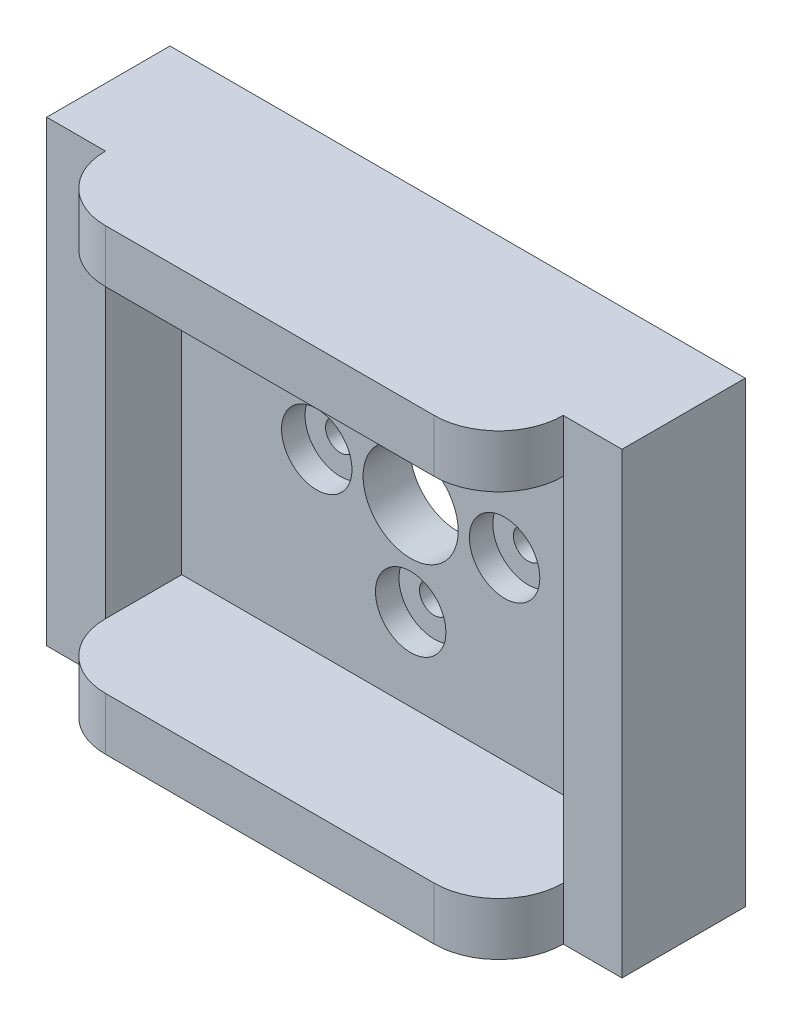
ISO-10303-21;
HEADER;
FILE_DESCRIPTION(('STEP AP214'),'2;1');
FILE_NAME('part.step','',(''),(''),'','','');
FILE_SCHEMA(('AUTOMOTIVE_DESIGN { 1 0 10303 214 1 1 1 1 }'));
ENDSEC;
DATA;
#1=APPLICATION_CONTEXT('core data for automotive mechanical design processes');
#2=APPLICATION_PROTOCOL_DEFINITION('international standard','automotive_design',2000,#1);
#3=PRODUCT_CONTEXT('',#1,'mechanical');
#4=PRODUCT('Part','Part','',(#3));
#5=PRODUCT_RELATED_PRODUCT_CATEGORY('part','',(#4));
#6=PRODUCT_DEFINITION_FORMATION('','',#4);
#7=PRODUCT_DEFINITION_CONTEXT('part definition',#1,'design');
#8=PRODUCT_DEFINITION('design','',#6,#7);
#9=PRODUCT_DEFINITION_SHAPE('','',#8);
#10=(LENGTH_UNIT() NAMED_UNIT(*) SI_UNIT(.MILLI.,.METRE.));
#11=(NAMED_UNIT(*) PLANE_ANGLE_UNIT() SI_UNIT($,.RADIAN.));
#12=(NAMED_UNIT(*) SI_UNIT($,.STERADIAN.) SOLID_ANGLE_UNIT());
#13=UNCERTAINTY_MEASURE_WITH_UNIT(LENGTH_MEASURE(1.E-05),#10,'distance_accuracy_value','');
#14=(GEOMETRIC_REPRESENTATION_CONTEXT(3) GLOBAL_UNCERTAINTY_ASSIGNED_CONTEXT((#13)) GLOBAL_UNIT_ASSIGNED_CONTEXT((#10,
#11,#12)) REPRESENTATION_CONTEXT('',''));
#15=CARTESIAN_POINT('',(0.,0.,0.));
#16=DIRECTION('',(0.,0.,1.));
#17=DIRECTION('',(1.,0.,0.));
#18=AXIS2_PLACEMENT_3D('',#15,#16,#17);
#19=CARTESIAN_POINT('',(13.9999999999999,-30.4999999999999,14.0000000000003));
#20=DIRECTION('',(0.,0.,-1.));
#21=DIRECTION('',(-1.,0.,0.));
#22=AXIS2_PLACEMENT_3D('',#19,#20,#21);
#23=PLANE('',#22);
#24=DIRECTION('',(1.,0.,0.));
#25=VECTOR('',#24,1.);
#26=CARTESIAN_POINT('',(19.4999999999996,-26.0000000000001,14.0000000000001));
#27=LINE('',#26,#25);
#28=CARTESIAN_POINT('',(-14.0000000000002,-26.0000000000001,14.0000000000001));
#29=VERTEX_POINT('',#28);
#30=CARTESIAN_POINT('',(13.9999999999998,-26.0000000000001,14.0000000000001));
#31=VERTEX_POINT('',#30);
#32=EDGE_CURVE('E288',#29,#31,#27,.T.);
#33=ORIENTED_EDGE('',*,*,#32,.F.);
#34=DIRECTION('',(0.,1.,0.));
#35=VECTOR('',#34,1.);
#36=CARTESIAN_POINT('',(-14.0000000000001,-30.4999999999999,13.9999999999999));
#37=LINE('',#36,#35);
#38=CARTESIAN_POINT('',(-14.0000000000001,-30.4999999999999,13.9999999999999));
#39=VERTEX_POINT('',#38);
#40=EDGE_CURVE('E342',#39,#29,#37,.T.);
#41=ORIENTED_EDGE('',*,*,#40,.F.);
#42=DIRECTION('',(-1.,0.,0.));
#43=VECTOR('',#42,1.);
#44=CARTESIAN_POINT('',(13.9999999999999,-30.4999999999999,14.0000000000003));
#45=LINE('',#44,#43);
#46=CARTESIAN_POINT('',(13.9999999999999,-30.4999999999999,14.0000000000003));
#47=VERTEX_POINT('',#46);
#48=EDGE_CURVE('E324',#47,#39,#45,.T.);
#49=ORIENTED_EDGE('',*,*,#48,.F.);
#50=DIRECTION('',(0.,1.,0.));
#51=VECTOR('',#50,1.);
#52=CARTESIAN_POINT('',(13.9999999999999,-30.4999999999999,14.0000000000003));
#53=LINE('',#52,#51);
#54=EDGE_CURVE('E349',#47,#31,#53,.T.);
#55=ORIENTED_EDGE('',*,*,#54,.T.);
#56=EDGE_LOOP('',(#33,#41,#49,#55));
#57=FACE_BOUND('',#56,.T.);
#58=ADVANCED_FACE('F114',(#57),#23,.F.);
#59=CARTESIAN_POINT('',(0.,-19.,2.));
#60=DIRECTION('',(0.,0.,-1.));
#61=DIRECTION('',(-1.,0.,0.));
#62=AXIS2_PLACEMENT_3D('',#59,#60,#61);
#63=CYLINDRICAL_SURFACE('',#62,1.25);
#64=CARTESIAN_POINT('',(0.,-19.,-2.));
#65=DIRECTION('',(0.,0.,-1.));
#66=DIRECTION('',(-1.,0.,0.));
#67=AXIS2_PLACEMENT_3D('',#64,#65,#66);
#68=CIRCLE('',#67,1.25);
#69=CARTESIAN_POINT('',(-1.25,-19.,-2.));
#70=VERTEX_POINT('',#69);
#71=EDGE_CURVE('E422',#70,#70,#68,.T.);
#72=ORIENTED_EDGE('',*,*,#71,.T.);
#73=EDGE_LOOP('',(#72));
#74=FACE_BOUND('',#73,.T.);
#75=CARTESIAN_POINT('',(0.,-19.,0.));
#76=DIRECTION('',(0.,0.,1.));
#77=DIRECTION('',(1.,0.,0.));
#78=AXIS2_PLACEMENT_3D('',#75,#76,#77);
#79=CIRCLE('',#78,1.25);
#80=CARTESIAN_POINT('',(1.25,-19.,0.));
#81=VERTEX_POINT('',#80);
#82=EDGE_CURVE('E409',#81,#81,#79,.T.);
#83=ORIENTED_EDGE('',*,*,#82,.T.);
#84=EDGE_LOOP('',(#83));
#85=FACE_BOUND('',#84,.T.);
#86=ADVANCED_FACE('F509',(#74,#85),#63,.F.);
#87=CARTESIAN_POINT('',(-8.,-11.,2.));
#88=DIRECTION('',(0.,0.,-1.));
#89=DIRECTION('',(-1.,0.,0.));
#90=AXIS2_PLACEMENT_3D('',#87,#88,#89);
#91=CYLINDRICAL_SURFACE('',#90,1.25);
#92=CARTESIAN_POINT('',(-8.,-11.,-2.));
#93=DIRECTION('',(0.,0.,-1.));
#94=DIRECTION('',(-1.,0.,0.));
#95=AXIS2_PLACEMENT_3D('',#92,#93,#94);
#96=CIRCLE('',#95,1.25);
#97=CARTESIAN_POINT('',(-9.25,-11.,-2.));
#98=VERTEX_POINT('',#97);
#99=EDGE_CURVE('E417',#98,#98,#96,.T.);
#100=ORIENTED_EDGE('',*,*,#99,.T.);
#101=EDGE_LOOP('',(#100));
#102=FACE_BOUND('',#101,.T.);
#103=CARTESIAN_POINT('',(-8.,-11.,0.));
#104=DIRECTION('',(0.,0.,1.));
#105=DIRECTION('',(1.,0.,0.));
#106=AXIS2_PLACEMENT_3D('',#103,#104,#105);
#107=CIRCLE('',#106,1.25);
#108=CARTESIAN_POINT('',(-6.75,-11.,0.));
#109=VERTEX_POINT('',#108);
#110=EDGE_CURVE('E444',#109,#109,#107,.T.);
#111=ORIENTED_EDGE('',*,*,#110,.T.);
#112=EDGE_LOOP('',(#111));
#113=FACE_BOUND('',#112,.T.);
#114=ADVANCED_FACE('F520',(#102,#113),#91,.F.);
#115=CARTESIAN_POINT('',(0.,-3.,2.));
#116=DIRECTION('',(0.,0.,-1.));
#117=DIRECTION('',(-1.,0.,0.));
#118=AXIS2_PLACEMENT_3D('',#115,#116,#117);
#119=CYLINDRICAL_SURFACE('',#118,1.25);
#120=CARTESIAN_POINT('',(0.,-3.,-2.));
#121=DIRECTION('',(0.,0.,-1.));
#122=DIRECTION('',(-1.,0.,0.));
#123=AXIS2_PLACEMENT_3D('',#120,#121,#122);
#124=CIRCLE('',#123,1.25);
#125=CARTESIAN_POINT('',(-1.25,-3.,-2.));
#126=VERTEX_POINT('',#125);
#127=EDGE_CURVE('E415',#126,#126,#124,.T.);
#128=ORIENTED_EDGE('',*,*,#127,.T.);
#129=EDGE_LOOP('',(#128));
#130=FACE_BOUND('',#129,.T.);
#131=CARTESIAN_POINT('',(0.,-3.,0.));
#132=DIRECTION('',(0.,0.,1.));
#133=DIRECTION('',(1.,0.,0.));
#134=AXIS2_PLACEMENT_3D('',#131,#132,#133);
#135=CIRCLE('',#134,1.25);
#136=CARTESIAN_POINT('',(1.25,-3.,0.));
#137=VERTEX_POINT('',#136);
#138=EDGE_CURVE('E441',#137,#137,#135,.T.);
#139=ORIENTED_EDGE('',*,*,#138,.T.);
#140=EDGE_LOOP('',(#139));
#141=FACE_BOUND('',#140,.T.);
#142=ADVANCED_FACE('F575',(#130,#141),#119,.F.);
#143=CARTESIAN_POINT('',(8.,-11.,2.));
#144=DIRECTION('',(0.,0.,-1.));
#145=DIRECTION('',(-1.,0.,0.));
#146=AXIS2_PLACEMENT_3D('',#143,#144,#145);
#147=CYLINDRICAL_SURFACE('',#146,1.25);
#148=CARTESIAN_POINT('',(8.,-11.,-2.));
#149=DIRECTION('',(0.,0.,-1.));
#150=DIRECTION('',(-1.,0.,0.));
#151=AXIS2_PLACEMENT_3D('',#148,#149,#150);
#152=CIRCLE('',#151,1.25);
#153=CARTESIAN_POINT('',(6.75,-11.,-2.));
#154=VERTEX_POINT('',#153);
#155=EDGE_CURVE('E403',#154,#154,#152,.T.);
#156=ORIENTED_EDGE('',*,*,#155,.T.);
#157=EDGE_LOOP('',(#156));
#158=FACE_BOUND('',#157,.T.);
#159=CARTESIAN_POINT('',(8.,-11.,0.));
#160=DIRECTION('',(0.,0.,1.));
#161=DIRECTION('',(1.,0.,0.));
#162=AXIS2_PLACEMENT_3D('',#159,#160,#161);
#163=CIRCLE('',#162,1.25);
#164=CARTESIAN_POINT('',(9.25,-11.,0.));
#165=VERTEX_POINT('',#164);
#166=EDGE_CURVE('E380',#165,#165,#163,.T.);
#167=ORIENTED_EDGE('',*,*,#166,.T.);
#168=EDGE_LOOP('',(#167));
#169=FACE_BOUND('',#168,.T.);
#170=ADVANCED_FACE('F567',(#158,#169),#147,.F.);
#171=CARTESIAN_POINT('',(0.,0.,2.));
#172=DIRECTION('',(0.,0.,1.));
#173=DIRECTION('',(1.,0.,0.));
#174=AXIS2_PLACEMENT_3D('',#171,#172,#173);
#175=PLANE('',#174);
#176=DIRECTION('',(1.,0.,0.));
#177=VECTOR('',#176,1.);
#178=CARTESIAN_POINT('',(19.4999999999996,3.99999999999989,2.));
#179=LINE('',#178,#177);
#180=CARTESIAN_POINT('',(-19.5,3.99999999999989,2.));
#181=VERTEX_POINT('',#180);
#182=CARTESIAN_POINT('',(19.4999999999996,3.99999999999989,2.));
#183=VERTEX_POINT('',#182);
#184=EDGE_CURVE('E289',#181,#183,#179,.T.);
#185=ORIENTED_EDGE('',*,*,#184,.F.);
#186=DIRECTION('',(0.,-1.,0.));
#187=VECTOR('',#186,1.);
#188=CARTESIAN_POINT('',(-19.5,-22.8563709291264,2.));
#189=LINE('',#188,#187);
#190=CARTESIAN_POINT('',(-19.5,-26.0000000000001,2.));
#191=VERTEX_POINT('',#190);
#192=EDGE_CURVE('E427',#181,#191,#189,.T.);
#193=ORIENTED_EDGE('',*,*,#192,.T.);
#194=DIRECTION('',(-1.,0.,0.));
#195=VECTOR('',#194,1.);
#196=CARTESIAN_POINT('',(19.4999999999996,-26.0000000000001,2.));
#197=LINE('',#196,#195);
#198=CARTESIAN_POINT('',(19.5,-26.0000000000001,2.));
#199=VERTEX_POINT('',#198);
#200=EDGE_CURVE('E293',#199,#191,#197,.T.);
#201=ORIENTED_EDGE('',*,*,#200,.F.);
#202=DIRECTION('',(0.,1.,0.));
#203=VECTOR('',#202,1.);
#204=CARTESIAN_POINT('',(19.5,-22.8563709291264,2.));
#205=LINE('',#204,#203);
#206=EDGE_CURVE('E432',#199,#183,#205,.T.);
#207=ORIENTED_EDGE('',*,*,#206,.T.);
#208=EDGE_LOOP('',(#185,#193,#201,#207));
#209=FACE_BOUND('',#208,.T.);
#210=CARTESIAN_POINT('',(0.,-3.,2.));
#211=DIRECTION('',(0.,0.,1.));
#212=DIRECTION('',(1.,0.,0.));
#213=AXIS2_PLACEMENT_3D('',#210,#211,#212);
#214=CIRCLE('',#213,3.);
#215=CARTESIAN_POINT('',(3.,-3.,2.));
#216=VERTEX_POINT('',#215);
#217=EDGE_CURVE('E377',#216,#216,#214,.T.);
#218=ORIENTED_EDGE('',*,*,#217,.F.);
#219=EDGE_LOOP('',(#218));
#220=FACE_BOUND('',#219,.T.);
#221=CARTESIAN_POINT('',(8.,-11.,2.));
#222=DIRECTION('',(0.,0.,1.));
#223=DIRECTION('',(1.,0.,0.));
#224=AXIS2_PLACEMENT_3D('',#221,#222,#223);
#225=CIRCLE('',#224,3.);
#226=CARTESIAN_POINT('',(11.,-11.,2.));
#227=VERTEX_POINT('',#226);
#228=EDGE_CURVE('E385',#227,#227,#225,.T.);
#229=ORIENTED_EDGE('',*,*,#228,.F.);
#230=EDGE_LOOP('',(#229));
#231=FACE_BOUND('',#230,.T.);
#232=CARTESIAN_POINT('',(0.,-19.,2.));
#233=DIRECTION('',(0.,0.,1.));
#234=DIRECTION('',(1.,0.,0.));
#235=AXIS2_PLACEMENT_3D('',#232,#233,#234);
#236=CIRCLE('',#235,3.);
#237=CARTESIAN_POINT('',(2.99999999999994,-19.,2.));
#238=VERTEX_POINT('',#237);
#239=EDGE_CURVE('E389',#238,#238,#236,.T.);
#240=ORIENTED_EDGE('',*,*,#239,.F.);
#241=EDGE_LOOP('',(#240));
#242=FACE_BOUND('',#241,.T.);
#243=CARTESIAN_POINT('',(-8.,-10.9999999999999,2.));
#244=DIRECTION('',(0.,0.,1.));
#245=DIRECTION('',(1.,0.,0.));
#246=AXIS2_PLACEMENT_3D('',#243,#244,#245);
#247=CIRCLE('',#246,3.);
#248=CARTESIAN_POINT('',(-5.,-10.9999999999999,2.));
#249=VERTEX_POINT('',#248);
#250=EDGE_CURVE('E397',#249,#249,#247,.T.);
#251=ORIENTED_EDGE('',*,*,#250,.F.);
#252=EDGE_LOOP('',(#251));
#253=FACE_BOUND('',#252,.T.);
#254=CARTESIAN_POINT('',(0.,-11.,2.));
#255=DIRECTION('',(0.,0.,1.));
#256=DIRECTION('',(1.,0.,0.));
#257=AXIS2_PLACEMENT_3D('',#254,#255,#256);
#258=CIRCLE('',#257,4.05);
#259=CARTESIAN_POINT('',(4.05,-11.,2.));
#260=VERTEX_POINT('',#259);
#261=EDGE_CURVE('E428',#260,#260,#258,.T.);
#262=ORIENTED_EDGE('',*,*,#261,.F.);
#263=EDGE_LOOP('',(#262));
#264=FACE_BOUND('',#263,.T.);
#265=ADVANCED_FACE('F120',(#209,#220,#231,#242,#253,#264),#175,.T.);
#266=CARTESIAN_POINT('',(0.,-11.,-3.));
#267=DIRECTION('',(0.,0.,1.));
#268=DIRECTION('',(1.,0.,0.));
#269=AXIS2_PLACEMENT_3D('',#266,#267,#268);
#270=CYLINDRICAL_SURFACE('',#269,4.05);
#271=ORIENTED_EDGE('',*,*,#261,.T.);
#272=EDGE_LOOP('',(#271));
#273=FACE_BOUND('',#272,.T.);
#274=CARTESIAN_POINT('',(0.,-11.,-2.));
#275=DIRECTION('',(0.,0.,-1.));
#276=DIRECTION('',(-1.,0.,0.));
#277=AXIS2_PLACEMENT_3D('',#274,#275,#276);
#278=CIRCLE('',#277,4.05);
#279=CARTESIAN_POINT('',(-4.05,-11.,-2.));
#280=VERTEX_POINT('',#279);
#281=EDGE_CURVE('E408',#280,#280,#278,.T.);
#282=ORIENTED_EDGE('',*,*,#281,.T.);
#283=EDGE_LOOP('',(#282));
#284=FACE_BOUND('',#283,.T.);
#285=ADVANCED_FACE('F562',(#273,#284),#270,.F.);
#286=CARTESIAN_POINT('',(0.,0.,-2.));
#287=DIRECTION('',(0.,0.,-1.));
#288=DIRECTION('',(-1.,0.,0.));
#289=AXIS2_PLACEMENT_3D('',#286,#287,#288);
#290=PLANE('',#289);
#291=ORIENTED_EDGE('',*,*,#281,.F.);
#292=EDGE_LOOP('',(#291));
#293=FACE_BOUND('',#292,.T.);
#294=ORIENTED_EDGE('',*,*,#99,.F.);
#295=EDGE_LOOP('',(#294));
#296=FACE_BOUND('',#295,.T.);
#297=DIRECTION('',(1.,0.,0.));
#298=VECTOR('',#297,1.);
#299=CARTESIAN_POINT('',(-19.5,-30.4999999999999,-2.));
#300=LINE('',#299,#298);
#301=CARTESIAN_POINT('',(-24.5,-30.4999999999999,-2.));
#302=VERTEX_POINT('',#301);
#303=CARTESIAN_POINT('',(24.5,-30.4999999999999,-2.));
#304=VERTEX_POINT('',#303);
#305=EDGE_CURVE('E334',#302,#304,#300,.T.);
#306=ORIENTED_EDGE('',*,*,#305,.F.);
#307=DIRECTION('',(0.,-1.,0.));
#308=VECTOR('',#307,1.);
#309=CARTESIAN_POINT('',(-24.5,8.4999999999999,-2.));
#310=LINE('',#309,#308);
#311=CARTESIAN_POINT('',(-24.5,8.4999999999999,-2.));
#312=VERTEX_POINT('',#311);
#313=EDGE_CURVE('E221',#312,#302,#310,.T.);
#314=ORIENTED_EDGE('',*,*,#313,.F.);
#315=DIRECTION('',(-1.,0.,0.));
#316=VECTOR('',#315,1.);
#317=CARTESIAN_POINT('',(0.,8.4999999999999,-2.));
#318=LINE('',#317,#316);
#319=CARTESIAN_POINT('',(24.5,8.4999999999999,-2.));
#320=VERTEX_POINT('',#319);
#321=EDGE_CURVE('E217',#320,#312,#318,.T.);
#322=ORIENTED_EDGE('',*,*,#321,.F.);
#323=DIRECTION('',(0.,1.,0.));
#324=VECTOR('',#323,1.);
#325=CARTESIAN_POINT('',(24.5,8.4999999999999,-2.));
#326=LINE('',#325,#324);
#327=EDGE_CURVE('E222',#304,#320,#326,.T.);
#328=ORIENTED_EDGE('',*,*,#327,.F.);
#329=EDGE_LOOP('',(#306,#314,#322,#328));
#330=FACE_BOUND('',#329,.T.);
#331=ORIENTED_EDGE('',*,*,#71,.F.);
#332=EDGE_LOOP('',(#331));
#333=FACE_BOUND('',#332,.T.);
#334=ORIENTED_EDGE('',*,*,#127,.F.);
#335=EDGE_LOOP('',(#334));
#336=FACE_BOUND('',#335,.T.);
#337=ORIENTED_EDGE('',*,*,#155,.F.);
#338=EDGE_LOOP('',(#337));
#339=FACE_BOUND('',#338,.T.);
#340=ADVANCED_FACE('F216',(#293,#296,#330,#333,#336,#339),#290,.T.);
#341=CARTESIAN_POINT('',(8.,-11.,0.));
#342=DIRECTION('',(0.,0.,1.));
#343=DIRECTION('',(1.,0.,0.));
#344=AXIS2_PLACEMENT_3D('',#341,#342,#343);
#345=CYLINDRICAL_SURFACE('',#344,3.);
#346=CARTESIAN_POINT('',(8.,-11.,0.));
#347=DIRECTION('',(0.,0.,1.));
#348=DIRECTION('',(1.,0.,0.));
#349=AXIS2_PLACEMENT_3D('',#346,#347,#348);
#350=CIRCLE('',#349,3.);
#351=CARTESIAN_POINT('',(11.,-11.,0.));
#352=VERTEX_POINT('',#351);
#353=EDGE_CURVE('E386',#352,#352,#350,.T.);
#354=ORIENTED_EDGE('',*,*,#353,.F.);
#355=EDGE_LOOP('',(#354));
#356=FACE_BOUND('',#355,.T.);
#357=ORIENTED_EDGE('',*,*,#228,.T.);
#358=EDGE_LOOP('',(#357));
#359=FACE_BOUND('',#358,.T.);
#360=ADVANCED_FACE('F544',(#356,#359),#345,.F.);
#361=CARTESIAN_POINT('',(8.,-11.,0.));
#362=DIRECTION('',(0.,0.,1.));
#363=DIRECTION('',(1.,0.,0.));
#364=AXIS2_PLACEMENT_3D('',#361,#362,#363);
#365=PLANE('',#364);
#366=ORIENTED_EDGE('',*,*,#166,.F.);
#367=EDGE_LOOP('',(#366));
#368=FACE_BOUND('',#367,.T.);
#369=ORIENTED_EDGE('',*,*,#353,.T.);
#370=EDGE_LOOP('',(#369));
#371=FACE_BOUND('',#370,.T.);
#372=ADVANCED_FACE('F539',(#368,#371),#365,.T.);
#373=CARTESIAN_POINT('',(0.,-3.,0.));
#374=DIRECTION('',(0.,0.,1.));
#375=DIRECTION('',(1.,0.,0.));
#376=AXIS2_PLACEMENT_3D('',#373,#374,#375);
#377=CYLINDRICAL_SURFACE('',#376,3.);
#378=CARTESIAN_POINT('',(0.,-3.,0.));
#379=DIRECTION('',(0.,0.,1.));
#380=DIRECTION('',(1.,0.,0.));
#381=AXIS2_PLACEMENT_3D('',#378,#379,#380);
#382=CIRCLE('',#381,3.);
#383=CARTESIAN_POINT('',(3.,-3.,0.));
#384=VERTEX_POINT('',#383);
#385=EDGE_CURVE('E373',#384,#384,#382,.T.);
#386=ORIENTED_EDGE('',*,*,#385,.F.);
#387=EDGE_LOOP('',(#386));
#388=FACE_BOUND('',#387,.T.);
#389=ORIENTED_EDGE('',*,*,#217,.T.);
#390=EDGE_LOOP('',(#389));
#391=FACE_BOUND('',#390,.T.);
#392=ADVANCED_FACE('F536',(#388,#391),#377,.F.);
#393=CARTESIAN_POINT('',(0.,-3.,0.));
#394=DIRECTION('',(0.,0.,1.));
#395=DIRECTION('',(1.,0.,0.));
#396=AXIS2_PLACEMENT_3D('',#393,#394,#395);
#397=PLANE('',#396);
#398=ORIENTED_EDGE('',*,*,#138,.F.);
#399=EDGE_LOOP('',(#398));
#400=FACE_BOUND('',#399,.T.);
#401=ORIENTED_EDGE('',*,*,#385,.T.);
#402=EDGE_LOOP('',(#401));
#403=FACE_BOUND('',#402,.T.);
#404=ADVANCED_FACE('F535',(#400,#403),#397,.T.);
#405=CARTESIAN_POINT('',(-8.,-10.9999999999999,0.));
#406=DIRECTION('',(0.,0.,1.));
#407=DIRECTION('',(1.,0.,0.));
#408=AXIS2_PLACEMENT_3D('',#405,#406,#407);
#409=CYLINDRICAL_SURFACE('',#408,3.);
#410=CARTESIAN_POINT('',(-8.,-10.9999999999999,0.));
#411=DIRECTION('',(0.,0.,1.));
#412=DIRECTION('',(1.,0.,0.));
#413=AXIS2_PLACEMENT_3D('',#410,#411,#412);
#414=CIRCLE('',#413,3.);
#415=CARTESIAN_POINT('',(-5.,-10.9999999999999,0.));
#416=VERTEX_POINT('',#415);
#417=EDGE_CURVE('E375',#416,#416,#414,.T.);
#418=ORIENTED_EDGE('',*,*,#417,.F.);
#419=EDGE_LOOP('',(#418));
#420=FACE_BOUND('',#419,.T.);
#421=ORIENTED_EDGE('',*,*,#250,.T.);
#422=EDGE_LOOP('',(#421));
#423=FACE_BOUND('',#422,.T.);
#424=ADVANCED_FACE('F533',(#420,#423),#409,.F.);
#425=CARTESIAN_POINT('',(-8.,-10.9999999999999,0.));
#426=DIRECTION('',(0.,0.,1.));
#427=DIRECTION('',(1.,0.,0.));
#428=AXIS2_PLACEMENT_3D('',#425,#426,#427);
#429=PLANE('',#428);
#430=ORIENTED_EDGE('',*,*,#110,.F.);
#431=EDGE_LOOP('',(#430));
#432=FACE_BOUND('',#431,.T.);
#433=ORIENTED_EDGE('',*,*,#417,.T.);
#434=EDGE_LOOP('',(#433));
#435=FACE_BOUND('',#434,.T.);
#436=ADVANCED_FACE('F552',(#432,#435),#429,.T.);
#437=CARTESIAN_POINT('',(0.,-19.,0.));
#438=DIRECTION('',(0.,0.,1.));
#439=DIRECTION('',(1.,0.,0.));
#440=AXIS2_PLACEMENT_3D('',#437,#438,#439);
#441=CYLINDRICAL_SURFACE('',#440,3.);
#442=CARTESIAN_POINT('',(0.,-19.,0.));
#443=DIRECTION('',(0.,0.,1.));
#444=DIRECTION('',(1.,0.,0.));
#445=AXIS2_PLACEMENT_3D('',#442,#443,#444);
#446=CIRCLE('',#445,3.);
#447=CARTESIAN_POINT('',(2.99999999999994,-19.,0.));
#448=VERTEX_POINT('',#447);
#449=EDGE_CURVE('E395',#448,#448,#446,.T.);
#450=ORIENTED_EDGE('',*,*,#449,.F.);
#451=EDGE_LOOP('',(#450));
#452=FACE_BOUND('',#451,.T.);
#453=ORIENTED_EDGE('',*,*,#239,.T.);
#454=EDGE_LOOP('',(#453));
#455=FACE_BOUND('',#454,.T.);
#456=ADVANCED_FACE('F550',(#452,#455),#441,.F.);
#457=CARTESIAN_POINT('',(0.,-19.,0.));
#458=DIRECTION('',(0.,0.,1.));
#459=DIRECTION('',(1.,0.,0.));
#460=AXIS2_PLACEMENT_3D('',#457,#458,#459);
#461=PLANE('',#460);
#462=ORIENTED_EDGE('',*,*,#82,.F.);
#463=EDGE_LOOP('',(#462));
#464=FACE_BOUND('',#463,.T.);
#465=ORIENTED_EDGE('',*,*,#449,.T.);
#466=EDGE_LOOP('',(#465));
#467=FACE_BOUND('',#466,.T.);
#468=ADVANCED_FACE('F532',(#464,#467),#461,.T.);
#469=CARTESIAN_POINT('',(13.9999999999998,8.4999999999999,8.5000000000001));
#470=DIRECTION('',(0.,-1.,0.));
#471=DIRECTION('',(0.,0.,-1.));
#472=AXIS2_PLACEMENT_3D('',#469,#470,#471);
#473=CYLINDRICAL_SURFACE('',#472,5.50000000000015);
#474=DIRECTION('',(0.,-1.,0.));
#475=VECTOR('',#474,1.);
#476=CARTESIAN_POINT('',(13.9999999999999,8.4999999999999,14.0000000000003));
#477=LINE('',#476,#475);
#478=CARTESIAN_POINT('',(13.9999999999999,8.4999999999999,14.0000000000003));
#479=VERTEX_POINT('',#478);
#480=CARTESIAN_POINT('',(13.9999999999998,3.99999999999989,14.0000000000001));
#481=VERTEX_POINT('',#480);
#482=EDGE_CURVE('E139',#479,#481,#477,.T.);
#483=ORIENTED_EDGE('',*,*,#482,.T.);
#484=CARTESIAN_POINT('',(13.9999999999998,3.99999999999989,8.5000000000001));
#485=DIRECTION('',(0.,1.,0.));
#486=DIRECTION('',(0.,0.,1.));
#487=AXIS2_PLACEMENT_3D('',#484,#485,#486);
#488=CIRCLE('',#487,5.50000000000015);
#489=CARTESIAN_POINT('',(19.5,3.99999999999989,8.5000000000001));
#490=VERTEX_POINT('',#489);
#491=EDGE_CURVE('E320',#481,#490,#488,.T.);
#492=ORIENTED_EDGE('',*,*,#491,.T.);
#493=DIRECTION('',(0.,-1.,0.));
#494=VECTOR('',#493,1.);
#495=CARTESIAN_POINT('',(19.5,8.4999999999999,8.5000000000001));
#496=LINE('',#495,#494);
#497=CARTESIAN_POINT('',(19.5,8.4999999999999,8.5000000000001));
#498=VERTEX_POINT('',#497);
#499=EDGE_CURVE('E368',#498,#490,#496,.T.);
#500=ORIENTED_EDGE('',*,*,#499,.F.);
#501=CARTESIAN_POINT('',(13.9999999999998,8.4999999999999,8.5000000000001));
#502=DIRECTION('',(0.,1.,0.));
#503=DIRECTION('',(0.,0.,1.));
#504=AXIS2_PLACEMENT_3D('',#501,#502,#503);
#505=CIRCLE('',#504,5.50000000000015);
#506=EDGE_CURVE('E233',#479,#498,#505,.T.);
#507=ORIENTED_EDGE('',*,*,#506,.F.);
#508=EDGE_LOOP('',(#483,#492,#500,#507));
#509=FACE_BOUND('',#508,.T.);
#510=ADVANCED_FACE('F493',(#509),#473,.T.);
#511=CARTESIAN_POINT('',(-14.0000000000002,8.4999999999999,8.5000000000001));
#512=DIRECTION('',(0.,-1.,0.));
#513=DIRECTION('',(0.,0.,-1.));
#514=AXIS2_PLACEMENT_3D('',#511,#512,#513);
#515=CYLINDRICAL_SURFACE('',#514,5.49999999999977);
#516=DIRECTION('',(0.,-1.,0.));
#517=VECTOR('',#516,1.);
#518=CARTESIAN_POINT('',(-19.5,8.4999999999999,8.5000000000001));
#519=LINE('',#518,#517);
#520=CARTESIAN_POINT('',(-19.5,8.4999999999999,8.5000000000001));
#521=VERTEX_POINT('',#520);
#522=CARTESIAN_POINT('',(-19.5,3.99999999999989,8.5000000000001));
#523=VERTEX_POINT('',#522);
#524=EDGE_CURVE('E364',#521,#523,#519,.T.);
#525=ORIENTED_EDGE('',*,*,#524,.T.);
#526=CARTESIAN_POINT('',(-14.0000000000002,3.99999999999989,8.5000000000001));
#527=DIRECTION('',(0.,1.,0.));
#528=DIRECTION('',(0.,0.,1.));
#529=AXIS2_PLACEMENT_3D('',#526,#527,#528);
#530=CIRCLE('',#529,5.49999999999977);
#531=CARTESIAN_POINT('',(-14.0000000000001,3.99999999999989,13.9999999999999));
#532=VERTEX_POINT('',#531);
#533=EDGE_CURVE('E12',#523,#532,#530,.T.);
#534=ORIENTED_EDGE('',*,*,#533,.T.);
#535=DIRECTION('',(0.,-1.,0.));
#536=VECTOR('',#535,1.);
#537=CARTESIAN_POINT('',(-14.0000000000001,8.4999999999999,13.9999999999999));
#538=LINE('',#537,#536);
#539=CARTESIAN_POINT('',(-14.0000000000001,8.4999999999999,13.9999999999999));
#540=VERTEX_POINT('',#539);
#541=EDGE_CURVE('E359',#540,#532,#538,.T.);
#542=ORIENTED_EDGE('',*,*,#541,.F.);
#543=CARTESIAN_POINT('',(-14.0000000000002,8.4999999999999,8.5000000000001));
#544=DIRECTION('',(0.,1.,0.));
#545=DIRECTION('',(0.,0.,1.));
#546=AXIS2_PLACEMENT_3D('',#543,#544,#545);
#547=CIRCLE('',#546,5.49999999999977);
#548=EDGE_CURVE('E229',#521,#540,#547,.T.);
#549=ORIENTED_EDGE('',*,*,#548,.F.);
#550=EDGE_LOOP('',(#525,#534,#542,#549));
#551=FACE_BOUND('',#550,.T.);
#552=ADVANCED_FACE('F500',(#551),#515,.T.);
#553=CARTESIAN_POINT('',(-1.88217497143485E-13,8.4999999999999,14.0000000000001));
#554=DIRECTION('',(0.,0.,1.));
#555=DIRECTION('',(1.,0.,0.));
#556=AXIS2_PLACEMENT_3D('',#553,#554,#555);
#557=PLANE('',#556);
#558=DIRECTION('',(-1.,0.,0.));
#559=VECTOR('',#558,1.);
#560=CARTESIAN_POINT('',(19.4999999999996,3.99999999999989,14.0000000000001));
#561=LINE('',#560,#559);
#562=EDGE_CURVE('E133',#481,#532,#561,.T.);
#563=ORIENTED_EDGE('',*,*,#562,.F.);
#564=ORIENTED_EDGE('',*,*,#482,.F.);
#565=DIRECTION('',(-1.,0.,0.));
#566=VECTOR('',#565,1.);
#567=CARTESIAN_POINT('',(-1.88217497143485E-13,8.4999999999999,14.0000000000001));
#568=LINE('',#567,#566);
#569=EDGE_CURVE('E351',#479,#540,#568,.T.);
#570=ORIENTED_EDGE('',*,*,#569,.T.);
#571=ORIENTED_EDGE('',*,*,#541,.T.);
#572=EDGE_LOOP('',(#563,#564,#570,#571));
#573=FACE_BOUND('',#572,.T.);
#574=ADVANCED_FACE('F492',(#573),#557,.T.);
#575=CARTESIAN_POINT('',(0.,8.4999999999999,0.));
#576=DIRECTION('',(0.,1.,0.));
#577=DIRECTION('',(0.,0.,1.));
#578=AXIS2_PLACEMENT_3D('',#575,#576,#577);
#579=PLANE('',#578);
#580=ORIENTED_EDGE('',*,*,#506,.T.);
#581=DIRECTION('',(-1.,0.,0.));
#582=VECTOR('',#581,1.);
#583=CARTESIAN_POINT('',(24.5,8.4999999999999,8.5000000000001));
#584=LINE('',#583,#582);
#585=CARTESIAN_POINT('',(24.5,8.4999999999999,8.5000000000001));
#586=VERTEX_POINT('',#585);
#587=EDGE_CURVE('E240',#586,#498,#584,.T.);
#588=ORIENTED_EDGE('',*,*,#587,.F.);
#589=DIRECTION('',(0.,0.,1.));
#590=VECTOR('',#589,1.);
#591=CARTESIAN_POINT('',(24.5,8.4999999999999,-2.));
#592=LINE('',#591,#590);
#593=EDGE_CURVE('E234',#320,#586,#592,.T.);
#594=ORIENTED_EDGE('',*,*,#593,.F.);
#595=ORIENTED_EDGE('',*,*,#321,.T.);
#596=DIRECTION('',(0.,0.,-1.));
#597=VECTOR('',#596,1.);
#598=CARTESIAN_POINT('',(-24.5,8.4999999999999,-2.));
#599=LINE('',#598,#597);
#600=CARTESIAN_POINT('',(-24.5,8.4999999999999,8.5000000000001));
#601=VERTEX_POINT('',#600);
#602=EDGE_CURVE('E271',#601,#312,#599,.T.);
#603=ORIENTED_EDGE('',*,*,#602,.F.);
#604=DIRECTION('',(1.,0.,0.));
#605=VECTOR('',#604,1.);
#606=CARTESIAN_POINT('',(-24.5,8.4999999999999,8.5000000000001));
#607=LINE('',#606,#605);
#608=EDGE_CURVE('E276',#601,#521,#607,.T.);
#609=ORIENTED_EDGE('',*,*,#608,.T.);
#610=ORIENTED_EDGE('',*,*,#548,.T.);
#611=ORIENTED_EDGE('',*,*,#569,.F.);
#612=EDGE_LOOP('',(#580,#588,#594,#595,#603,#609,#610,#611));
#613=FACE_BOUND('',#612,.T.);
#614=ADVANCED_FACE('F236',(#613),#579,.T.);
#615=CARTESIAN_POINT('',(13.9999999999998,-30.4999999999999,8.5000000000001));
#616=DIRECTION('',(0.,1.,0.));
#617=DIRECTION('',(0.,0.,1.));
#618=AXIS2_PLACEMENT_3D('',#615,#616,#617);
#619=CYLINDRICAL_SURFACE('',#618,5.50000000000015);
#620=DIRECTION('',(0.,1.,0.));
#621=VECTOR('',#620,1.);
#622=CARTESIAN_POINT('',(19.5,-30.4999999999999,8.5000000000001));
#623=LINE('',#622,#621);
#624=CARTESIAN_POINT('',(19.5,-30.4999999999999,8.5000000000001));
#625=VERTEX_POINT('',#624);
#626=CARTESIAN_POINT('',(19.5,-26.0000000000001,8.5000000000001));
#627=VERTEX_POINT('',#626);
#628=EDGE_CURVE('E331',#625,#627,#623,.T.);
#629=ORIENTED_EDGE('',*,*,#628,.T.);
#630=CARTESIAN_POINT('',(13.9999999999998,-26.0000000000001,8.5000000000001));
#631=DIRECTION('',(0.,-1.,0.));
#632=DIRECTION('',(0.,0.,-1.));
#633=AXIS2_PLACEMENT_3D('',#630,#631,#632);
#634=CIRCLE('',#633,5.50000000000015);
#635=EDGE_CURVE('E312',#627,#31,#634,.T.);
#636=ORIENTED_EDGE('',*,*,#635,.T.);
#637=ORIENTED_EDGE('',*,*,#54,.F.);
#638=CARTESIAN_POINT('',(13.9999999999998,-30.4999999999999,8.5000000000001));
#639=DIRECTION('',(0.,-1.,0.));
#640=DIRECTION('',(0.,0.,-1.));
#641=AXIS2_PLACEMENT_3D('',#638,#639,#640);
#642=CIRCLE('',#641,5.50000000000015);
#643=EDGE_CURVE('E321',#625,#47,#642,.T.);
#644=ORIENTED_EDGE('',*,*,#643,.F.);
#645=EDGE_LOOP('',(#629,#636,#637,#644));
#646=FACE_BOUND('',#645,.T.);
#647=ADVANCED_FACE('F470',(#646),#619,.T.);
#648=CARTESIAN_POINT('',(-14.0000000000002,-30.4999999999999,8.5000000000001));
#649=DIRECTION('',(0.,1.,0.));
#650=DIRECTION('',(0.,0.,1.));
#651=AXIS2_PLACEMENT_3D('',#648,#649,#650);
#652=CYLINDRICAL_SURFACE('',#651,5.49999999999978);
#653=ORIENTED_EDGE('',*,*,#40,.T.);
#654=CARTESIAN_POINT('',(-14.0000000000002,-26.0000000000001,8.5000000000001));
#655=DIRECTION('',(0.,-1.,0.));
#656=DIRECTION('',(0.,0.,-1.));
#657=AXIS2_PLACEMENT_3D('',#654,#655,#656);
#658=CIRCLE('',#657,5.49999999999978);
#659=CARTESIAN_POINT('',(-19.5,-26.0000000000001,8.5000000000001));
#660=VERTEX_POINT('',#659);
#661=EDGE_CURVE('E121',#29,#660,#658,.T.);
#662=ORIENTED_EDGE('',*,*,#661,.T.);
#663=DIRECTION('',(0.,1.,0.));
#664=VECTOR('',#663,1.);
#665=CARTESIAN_POINT('',(-19.5,-30.4999999999999,8.5000000000001));
#666=LINE('',#665,#664);
#667=CARTESIAN_POINT('',(-19.5,-30.4999999999999,8.5000000000001));
#668=VERTEX_POINT('',#667);
#669=EDGE_CURVE('E339',#668,#660,#666,.T.);
#670=ORIENTED_EDGE('',*,*,#669,.F.);
#671=CARTESIAN_POINT('',(-14.0000000000002,-30.4999999999999,8.5000000000001));
#672=DIRECTION('',(0.,-1.,0.));
#673=DIRECTION('',(0.,0.,-1.));
#674=AXIS2_PLACEMENT_3D('',#671,#672,#673);
#675=CIRCLE('',#674,5.49999999999978);
#676=EDGE_CURVE('E327',#39,#668,#675,.T.);
#677=ORIENTED_EDGE('',*,*,#676,.F.);
#678=EDGE_LOOP('',(#653,#662,#670,#677));
#679=FACE_BOUND('',#678,.T.);
#680=ADVANCED_FACE('F454',(#679),#652,.T.);
#681=CARTESIAN_POINT('',(13.9999999999998,-30.4999999999999,8.5000000000001));
#682=DIRECTION('',(0.,-1.,0.));
#683=DIRECTION('',(0.,0.,-1.));
#684=AXIS2_PLACEMENT_3D('',#681,#682,#683);
#685=PLANE('',#684);
#686=ORIENTED_EDGE('',*,*,#643,.T.);
#687=ORIENTED_EDGE('',*,*,#48,.T.);
#688=ORIENTED_EDGE('',*,*,#676,.T.);
#689=DIRECTION('',(1.,0.,0.));
#690=VECTOR('',#689,1.);
#691=CARTESIAN_POINT('',(-24.5,-30.4999999999999,8.5000000000001));
#692=LINE('',#691,#690);
#693=CARTESIAN_POINT('',(-24.5,-30.4999999999999,8.5000000000001));
#694=VERTEX_POINT('',#693);
#695=EDGE_CURVE('E282',#694,#668,#692,.T.);
#696=ORIENTED_EDGE('',*,*,#695,.F.);
#697=DIRECTION('',(0.,0.,1.));
#698=VECTOR('',#697,1.);
#699=CARTESIAN_POINT('',(-24.5,-30.4999999999999,-2.));
#700=LINE('',#699,#698);
#701=EDGE_CURVE('E269',#302,#694,#700,.T.);
#702=ORIENTED_EDGE('',*,*,#701,.F.);
#703=ORIENTED_EDGE('',*,*,#305,.T.);
#704=DIRECTION('',(0.,0.,-1.));
#705=VECTOR('',#704,1.);
#706=CARTESIAN_POINT('',(24.5,-30.4999999999999,-2.));
#707=LINE('',#706,#705);
#708=CARTESIAN_POINT('',(24.5,-30.4999999999999,8.5000000000001));
#709=VERTEX_POINT('',#708);
#710=EDGE_CURVE('E246',#709,#304,#707,.T.);
#711=ORIENTED_EDGE('',*,*,#710,.F.);
#712=DIRECTION('',(-1.,0.,0.));
#713=VECTOR('',#712,1.);
#714=CARTESIAN_POINT('',(24.5,-30.4999999999999,8.5000000000001));
#715=LINE('',#714,#713);
#716=EDGE_CURVE('E260',#709,#625,#715,.T.);
#717=ORIENTED_EDGE('',*,*,#716,.T.);
#718=EDGE_LOOP('',(#686,#687,#688,#696,#702,#703,#711,#717));
#719=FACE_BOUND('',#718,.T.);
#720=ADVANCED_FACE('F482',(#719),#685,.T.);
#721=CARTESIAN_POINT('',(19.4999999999996,-26.0000000000001,-47.2036584005698));
#722=DIRECTION('',(0.,-1.,0.));
#723=DIRECTION('',(0.,0.,-1.));
#724=AXIS2_PLACEMENT_3D('',#721,#722,#723);
#725=PLANE('',#724);
#726=DIRECTION('',(0.,0.,1.));
#727=VECTOR('',#726,1.);
#728=CARTESIAN_POINT('',(19.4999999999996,-26.0000000000001,-47.2036584005698));
#729=LINE('',#728,#727);
#730=EDGE_CURVE('E302',#199,#627,#729,.T.);
#731=ORIENTED_EDGE('',*,*,#730,.F.);
#732=ORIENTED_EDGE('',*,*,#200,.T.);
#733=DIRECTION('',(0.,0.,1.));
#734=VECTOR('',#733,1.);
#735=CARTESIAN_POINT('',(-19.5,-26.0000000000001,-47.2036584005698));
#736=LINE('',#735,#734);
#737=EDGE_CURVE('E300',#191,#660,#736,.T.);
#738=ORIENTED_EDGE('',*,*,#737,.T.);
#739=ORIENTED_EDGE('',*,*,#661,.F.);
#740=ORIENTED_EDGE('',*,*,#32,.T.);
#741=ORIENTED_EDGE('',*,*,#635,.F.);
#742=EDGE_LOOP('',(#731,#732,#738,#739,#740,#741));
#743=FACE_BOUND('',#742,.T.);
#744=ADVANCED_FACE('F463',(#743),#725,.F.);
#745=CARTESIAN_POINT('',(19.4999999999996,3.99999999999989,-47.2036584005698));
#746=DIRECTION('',(0.,1.,0.));
#747=DIRECTION('',(0.,0.,1.));
#748=AXIS2_PLACEMENT_3D('',#745,#746,#747);
#749=PLANE('',#748);
#750=ORIENTED_EDGE('',*,*,#562,.T.);
#751=ORIENTED_EDGE('',*,*,#533,.F.);
#752=DIRECTION('',(0.,0.,1.));
#753=VECTOR('',#752,1.);
#754=CARTESIAN_POINT('',(-19.5,3.99999999999989,-47.2036584005698));
#755=LINE('',#754,#753);
#756=EDGE_CURVE('E292',#181,#523,#755,.T.);
#757=ORIENTED_EDGE('',*,*,#756,.F.);
#758=ORIENTED_EDGE('',*,*,#184,.T.);
#759=DIRECTION('',(0.,0.,1.));
#760=VECTOR('',#759,1.);
#761=CARTESIAN_POINT('',(19.4999999999996,3.99999999999989,-47.2036584005698));
#762=LINE('',#761,#760);
#763=EDGE_CURVE('E297',#183,#490,#762,.T.);
#764=ORIENTED_EDGE('',*,*,#763,.T.);
#765=ORIENTED_EDGE('',*,*,#491,.F.);
#766=EDGE_LOOP('',(#750,#751,#757,#758,#764,#765));
#767=FACE_BOUND('',#766,.T.);
#768=ADVANCED_FACE('F490',(#767),#749,.F.);
#769=CARTESIAN_POINT('',(-24.5,8.4999999999999,8.5000000000001));
#770=DIRECTION('',(0.,0.,-1.));
#771=DIRECTION('',(-1.,0.,0.));
#772=AXIS2_PLACEMENT_3D('',#769,#770,#771);
#773=PLANE('',#772);
#774=ORIENTED_EDGE('',*,*,#669,.T.);
#775=DIRECTION('',(0.,1.,0.));
#776=VECTOR('',#775,1.);
#777=CARTESIAN_POINT('',(-19.5,8.4999999999999,8.5000000000001));
#778=LINE('',#777,#776);
#779=EDGE_CURVE('E265',#660,#523,#778,.T.);
#780=ORIENTED_EDGE('',*,*,#779,.T.);
#781=ORIENTED_EDGE('',*,*,#524,.F.);
#782=ORIENTED_EDGE('',*,*,#608,.F.);
#783=DIRECTION('',(0.,1.,0.));
#784=VECTOR('',#783,1.);
#785=CARTESIAN_POINT('',(-24.5,8.4999999999999,8.5000000000001));
#786=LINE('',#785,#784);
#787=EDGE_CURVE('E266',#694,#601,#786,.T.);
#788=ORIENTED_EDGE('',*,*,#787,.F.);
#789=ORIENTED_EDGE('',*,*,#695,.T.);
#790=EDGE_LOOP('',(#774,#780,#781,#782,#788,#789));
#791=FACE_BOUND('',#790,.T.);
#792=ADVANCED_FACE('F479',(#791),#773,.F.);
#793=CARTESIAN_POINT('',(-24.5,0.,0.));
#794=DIRECTION('',(-1.,0.,0.));
#795=DIRECTION('',(0.,0.,1.));
#796=AXIS2_PLACEMENT_3D('',#793,#794,#795);
#797=PLANE('',#796);
#798=ORIENTED_EDGE('',*,*,#313,.T.);
#799=ORIENTED_EDGE('',*,*,#701,.T.);
#800=ORIENTED_EDGE('',*,*,#787,.T.);
#801=ORIENTED_EDGE('',*,*,#602,.T.);
#802=EDGE_LOOP('',(#798,#799,#800,#801));
#803=FACE_BOUND('',#802,.T.);
#804=ADVANCED_FACE('F497',(#803),#797,.T.);
#805=CARTESIAN_POINT('',(-19.5,0.,0.));
#806=DIRECTION('',(-1.,0.,0.));
#807=DIRECTION('',(0.,0.,1.));
#808=AXIS2_PLACEMENT_3D('',#805,#806,#807);
#809=PLANE('',#808);
#810=ORIENTED_EDGE('',*,*,#737,.F.);
#811=ORIENTED_EDGE('',*,*,#192,.F.);
#812=ORIENTED_EDGE('',*,*,#756,.T.);
#813=ORIENTED_EDGE('',*,*,#779,.F.);
#814=EDGE_LOOP('',(#810,#811,#812,#813));
#815=FACE_BOUND('',#814,.T.);
#816=ADVANCED_FACE('F474',(#815),#809,.F.);
#817=CARTESIAN_POINT('',(19.5,0.,0.));
#818=DIRECTION('',(-1.,0.,0.));
#819=DIRECTION('',(0.,0.,1.));
#820=AXIS2_PLACEMENT_3D('',#817,#818,#819);
#821=PLANE('',#820);
#822=ORIENTED_EDGE('',*,*,#763,.F.);
#823=ORIENTED_EDGE('',*,*,#206,.F.);
#824=ORIENTED_EDGE('',*,*,#730,.T.);
#825=DIRECTION('',(0.,-1.,0.));
#826=VECTOR('',#825,1.);
#827=CARTESIAN_POINT('',(19.5,8.4999999999999,8.5000000000001));
#828=LINE('',#827,#826);
#829=EDGE_CURVE('E247',#490,#627,#828,.T.);
#830=ORIENTED_EDGE('',*,*,#829,.F.);
#831=EDGE_LOOP('',(#822,#823,#824,#830));
#832=FACE_BOUND('',#831,.T.);
#833=ADVANCED_FACE('F486',(#832),#821,.T.);
#834=CARTESIAN_POINT('',(24.5,8.4999999999999,8.5000000000001));
#835=DIRECTION('',(0.,0.,-1.));
#836=DIRECTION('',(-1.,0.,0.));
#837=AXIS2_PLACEMENT_3D('',#834,#835,#836);
#838=PLANE('',#837);
#839=ORIENTED_EDGE('',*,*,#499,.T.);
#840=ORIENTED_EDGE('',*,*,#829,.T.);
#841=ORIENTED_EDGE('',*,*,#628,.F.);
#842=ORIENTED_EDGE('',*,*,#716,.F.);
#843=DIRECTION('',(0.,-1.,0.));
#844=VECTOR('',#843,1.);
#845=CARTESIAN_POINT('',(24.5,8.4999999999999,8.5000000000001));
#846=LINE('',#845,#844);
#847=EDGE_CURVE('E241',#586,#709,#846,.T.);
#848=ORIENTED_EDGE('',*,*,#847,.F.);
#849=ORIENTED_EDGE('',*,*,#587,.T.);
#850=EDGE_LOOP('',(#839,#840,#841,#842,#848,#849));
#851=FACE_BOUND('',#850,.T.);
#852=ADVANCED_FACE('F488',(#851),#838,.F.);
#853=CARTESIAN_POINT('',(24.5,0.,0.));
#854=DIRECTION('',(-1.,0.,0.));
#855=DIRECTION('',(0.,0.,1.));
#856=AXIS2_PLACEMENT_3D('',#853,#854,#855);
#857=PLANE('',#856);
#858=ORIENTED_EDGE('',*,*,#327,.T.);
#859=ORIENTED_EDGE('',*,*,#593,.T.);
#860=ORIENTED_EDGE('',*,*,#847,.T.);
#861=ORIENTED_EDGE('',*,*,#710,.T.);
#862=EDGE_LOOP('',(#858,#859,#860,#861));
#863=FACE_BOUND('',#862,.T.);
#864=ADVANCED_FACE('F242',(#863),#857,.F.);
#865=CLOSED_SHELL('',(#58,#86,#114,#142,#170,#265,#285,#340,#360,#372,#392,#404,#424,#436,#456,
#468,#510,#552,#574,#614,#647,#680,#720,#744,#768,#792,#804,#816,#833,#852,#864));
#866=MANIFOLD_SOLID_BREP('B2',#865);
#867=ADVANCED_BREP_SHAPE_REPRESENTATION('',(#18,#866),#14);
#868=SHAPE_DEFINITION_REPRESENTATION(#9,#867);
ENDSEC;
END-ISO-10303-21;
